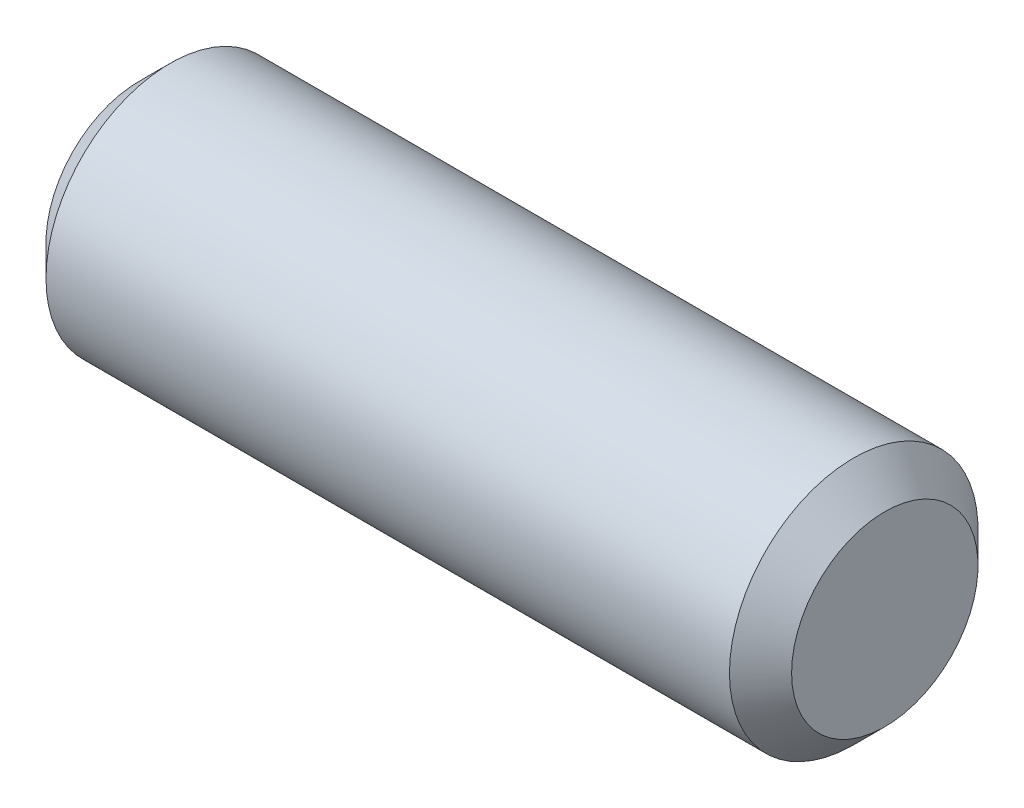
ISO-10303-21;
HEADER;
FILE_DESCRIPTION(('STEP AP214'),'2;1');
FILE_NAME('part.step','',(''),(''),'','','');
FILE_SCHEMA(('AUTOMOTIVE_DESIGN { 1 0 10303 214 1 1 1 1 }'));
ENDSEC;
DATA;
#1=APPLICATION_CONTEXT('core data for automotive mechanical design processes');
#2=APPLICATION_PROTOCOL_DEFINITION('international standard','automotive_design',2000,#1);
#3=PRODUCT_CONTEXT('',#1,'mechanical');
#4=PRODUCT('Part','Part','',(#3));
#5=PRODUCT_RELATED_PRODUCT_CATEGORY('part','',(#4));
#6=PRODUCT_DEFINITION_FORMATION('','',#4);
#7=PRODUCT_DEFINITION_CONTEXT('part definition',#1,'design');
#8=PRODUCT_DEFINITION('design','',#6,#7);
#9=PRODUCT_DEFINITION_SHAPE('','',#8);
#10=(LENGTH_UNIT() NAMED_UNIT(*) SI_UNIT(.MILLI.,.METRE.));
#11=(NAMED_UNIT(*) PLANE_ANGLE_UNIT() SI_UNIT($,.RADIAN.));
#12=(NAMED_UNIT(*) SI_UNIT($,.STERADIAN.) SOLID_ANGLE_UNIT());
#13=UNCERTAINTY_MEASURE_WITH_UNIT(LENGTH_MEASURE(1.E-05),#10,'distance_accuracy_value','');
#14=(GEOMETRIC_REPRESENTATION_CONTEXT(3) GLOBAL_UNCERTAINTY_ASSIGNED_CONTEXT((#13)) GLOBAL_UNIT_ASSIGNED_CONTEXT((#10,
#11,#12)) REPRESENTATION_CONTEXT('',''));
#15=CARTESIAN_POINT('',(0.,0.,0.));
#16=DIRECTION('',(0.,0.,1.));
#17=DIRECTION('',(1.,0.,0.));
#18=AXIS2_PLACEMENT_3D('',#15,#16,#17);
#19=CARTESIAN_POINT('',(0.,0.,0.));
#20=DIRECTION('',(1.,0.,0.));
#21=DIRECTION('',(0.,0.,-1.));
#22=AXIS2_PLACEMENT_3D('',#19,#20,#21);
#23=PLANE('',#22);
#24=CARTESIAN_POINT('',(0.,0.,0.));
#25=DIRECTION('',(1.,0.,0.));
#26=DIRECTION('',(0.,0.,-1.));
#27=AXIS2_PLACEMENT_3D('',#24,#25,#26);
#28=CIRCLE('',#27,3.);
#29=CARTESIAN_POINT('',(0.,0.,-3.));
#30=VERTEX_POINT('',#29);
#31=EDGE_CURVE('E10',#30,#30,#28,.F.);
#32=ORIENTED_EDGE('',*,*,#31,.T.);
#33=EDGE_LOOP('',(#32));
#34=FACE_BOUND('',#33,.T.);
#35=ADVANCED_FACE('F35',(#34),#23,.F.);
#36=CARTESIAN_POINT('',(0.,0.,0.));
#37=DIRECTION('',(-1.,0.,0.));
#38=DIRECTION('',(0.,0.,1.));
#39=AXIS2_PLACEMENT_3D('',#36,#37,#38);
#40=CYLINDRICAL_SURFACE('',#39,4.);
#41=CARTESIAN_POINT('',(23.,0.,0.));
#42=DIRECTION('',(-1.,0.,0.));
#43=DIRECTION('',(0.,0.,1.));
#44=AXIS2_PLACEMENT_3D('',#41,#42,#43);
#45=CIRCLE('',#44,4.);
#46=CARTESIAN_POINT('',(23.,0.,4.));
#47=VERTEX_POINT('',#46);
#48=EDGE_CURVE('E46',#47,#47,#45,.T.);
#49=ORIENTED_EDGE('',*,*,#48,.T.);
#50=EDGE_LOOP('',(#49));
#51=FACE_BOUND('',#50,.T.);
#52=CARTESIAN_POINT('',(1.00000000000001,0.,0.));
#53=DIRECTION('',(1.,0.,0.));
#54=DIRECTION('',(0.,0.,-1.));
#55=AXIS2_PLACEMENT_3D('',#52,#53,#54);
#56=CIRCLE('',#55,4.);
#57=CARTESIAN_POINT('',(1.00000000000001,0.,-4.));
#58=VERTEX_POINT('',#57);
#59=EDGE_CURVE('E50',#58,#58,#56,.T.);
#60=ORIENTED_EDGE('',*,*,#59,.T.);
#61=EDGE_LOOP('',(#60));
#62=FACE_BOUND('',#61,.T.);
#63=ADVANCED_FACE('F56',(#51,#62),#40,.T.);
#64=CARTESIAN_POINT('',(24.,0.,0.));
#65=DIRECTION('',(-1.,0.,0.));
#66=DIRECTION('',(0.,0.,1.));
#67=AXIS2_PLACEMENT_3D('',#64,#65,#66);
#68=PLANE('',#67);
#69=CARTESIAN_POINT('',(24.,0.,0.));
#70=DIRECTION('',(-1.,0.,0.));
#71=DIRECTION('',(0.,0.,1.));
#72=AXIS2_PLACEMENT_3D('',#69,#70,#71);
#73=CIRCLE('',#72,2.99999999999999);
#74=CARTESIAN_POINT('',(24.,0.,2.99999999999999));
#75=VERTEX_POINT('',#74);
#76=EDGE_CURVE('E42',#75,#75,#73,.F.);
#77=ORIENTED_EDGE('',*,*,#76,.T.);
#78=EDGE_LOOP('',(#77));
#79=FACE_BOUND('',#78,.T.);
#80=ADVANCED_FACE('F64',(#79),#68,.F.);
#81=CARTESIAN_POINT('',(23.,0.,0.));
#82=DIRECTION('',(-1.,0.,0.));
#83=DIRECTION('',(0.,0.,1.));
#84=AXIS2_PLACEMENT_3D('',#81,#82,#83);
#85=CONICAL_SURFACE('',#84,4.,0.785398163397448);
#86=ORIENTED_EDGE('',*,*,#76,.F.);
#87=EDGE_LOOP('',(#86));
#88=FACE_BOUND('',#87,.T.);
#89=ORIENTED_EDGE('',*,*,#48,.F.);
#90=EDGE_LOOP('',(#89));
#91=FACE_BOUND('',#90,.T.);
#92=ADVANCED_FACE('F60',(#88,#91),#85,.T.);
#93=CARTESIAN_POINT('',(0.,0.,0.));
#94=DIRECTION('',(1.,0.,0.));
#95=DIRECTION('',(0.,0.,-1.));
#96=AXIS2_PLACEMENT_3D('',#93,#94,#95);
#97=CONICAL_SURFACE('',#96,3.,0.785398163397447);
#98=ORIENTED_EDGE('',*,*,#59,.F.);
#99=EDGE_LOOP('',(#98));
#100=FACE_BOUND('',#99,.T.);
#101=ORIENTED_EDGE('',*,*,#31,.F.);
#102=EDGE_LOOP('',(#101));
#103=FACE_BOUND('',#102,.T.);
#104=ADVANCED_FACE('F37',(#100,#103),#97,.T.);
#105=CLOSED_SHELL('',(#35,#63,#80,#92,#104));
#106=MANIFOLD_SOLID_BREP('B2',#105);
#107=ADVANCED_BREP_SHAPE_REPRESENTATION('',(#18,#106),#14);
#108=SHAPE_DEFINITION_REPRESENTATION(#9,#107);
ENDSEC;
END-ISO-10303-21;
